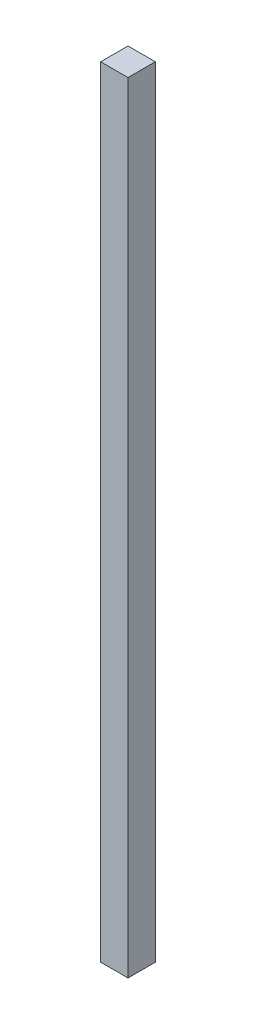
ISO-10303-21;
HEADER;
FILE_DESCRIPTION(('STEP AP214'),'2;1');
FILE_NAME('part.step','',(''),(''),'','','');
FILE_SCHEMA(('AUTOMOTIVE_DESIGN { 1 0 10303 214 1 1 1 1 }'));
ENDSEC;
DATA;
#1=APPLICATION_CONTEXT('core data for automotive mechanical design processes');
#2=APPLICATION_PROTOCOL_DEFINITION('international standard','automotive_design',2000,#1);
#3=PRODUCT_CONTEXT('',#1,'mechanical');
#4=PRODUCT('Part','Part','',(#3));
#5=PRODUCT_RELATED_PRODUCT_CATEGORY('part','',(#4));
#6=PRODUCT_DEFINITION_FORMATION('','',#4);
#7=PRODUCT_DEFINITION_CONTEXT('part definition',#1,'design');
#8=PRODUCT_DEFINITION('design','',#6,#7);
#9=PRODUCT_DEFINITION_SHAPE('','',#8);
#10=(LENGTH_UNIT() NAMED_UNIT(*) SI_UNIT(.MILLI.,.METRE.));
#11=(NAMED_UNIT(*) PLANE_ANGLE_UNIT() SI_UNIT($,.RADIAN.));
#12=(NAMED_UNIT(*) SI_UNIT($,.STERADIAN.) SOLID_ANGLE_UNIT());
#13=UNCERTAINTY_MEASURE_WITH_UNIT(LENGTH_MEASURE(1.E-05),#10,'distance_accuracy_value','');
#14=(GEOMETRIC_REPRESENTATION_CONTEXT(3) GLOBAL_UNCERTAINTY_ASSIGNED_CONTEXT((#13)) GLOBAL_UNIT_ASSIGNED_CONTEXT((#10,
#11,#12)) REPRESENTATION_CONTEXT('',''));
#15=CARTESIAN_POINT('',(0.,0.,0.));
#16=DIRECTION('',(0.,0.,1.));
#17=DIRECTION('',(1.,0.,0.));
#18=AXIS2_PLACEMENT_3D('',#15,#16,#17);
#19=CARTESIAN_POINT('',(-24.5945945945946,2000.,-16.2162162162162));
#20=DIRECTION('',(1.,0.,0.));
#21=DIRECTION('',(0.,0.,-1.));
#22=AXIS2_PLACEMENT_3D('',#19,#20,#21);
#23=PLANE('',#22);
#24=DIRECTION('',(0.,0.,1.));
#25=VECTOR('',#24,1.);
#26=CARTESIAN_POINT('',(-24.5945945945946,0.,-16.2162162162162));
#27=LINE('',#26,#25);
#28=CARTESIAN_POINT('',(-24.5945945945946,0.,-16.2162162162162));
#29=VERTEX_POINT('',#28);
#30=CARTESIAN_POINT('',(-24.5945945945946,0.,53.7837837837838));
#31=VERTEX_POINT('',#30);
#32=EDGE_CURVE('E102',#29,#31,#27,.T.);
#33=ORIENTED_EDGE('',*,*,#32,.T.);
#34=DIRECTION('',(0.,-1.,0.));
#35=VECTOR('',#34,1.);
#36=CARTESIAN_POINT('',(-24.5945945945946,2000.,53.7837837837838));
#37=LINE('',#36,#35);
#38=CARTESIAN_POINT('',(-24.5945945945946,2000.,53.7837837837838));
#39=VERTEX_POINT('',#38);
#40=EDGE_CURVE('E11',#39,#31,#37,.T.);
#41=ORIENTED_EDGE('',*,*,#40,.F.);
#42=DIRECTION('',(0.,0.,1.));
#43=VECTOR('',#42,1.);
#44=CARTESIAN_POINT('',(-24.5945945945946,2000.,-16.2162162162162));
#45=LINE('',#44,#43);
#46=CARTESIAN_POINT('',(-24.5945945945946,2000.,-16.2162162162162));
#47=VERTEX_POINT('',#46);
#48=EDGE_CURVE('E90',#47,#39,#45,.T.);
#49=ORIENTED_EDGE('',*,*,#48,.F.);
#50=DIRECTION('',(0.,-1.,0.));
#51=VECTOR('',#50,1.);
#52=CARTESIAN_POINT('',(-24.5945945945946,2000.,-16.2162162162162));
#53=LINE('',#52,#51);
#54=EDGE_CURVE('E98',#47,#29,#53,.T.);
#55=ORIENTED_EDGE('',*,*,#54,.T.);
#56=EDGE_LOOP('',(#33,#41,#49,#55));
#57=FACE_BOUND('',#56,.T.);
#58=ADVANCED_FACE('F39',(#57),#23,.F.);
#59=CARTESIAN_POINT('',(-24.5945945945946,2000.,53.7837837837838));
#60=DIRECTION('',(0.,0.,-1.));
#61=DIRECTION('',(-1.,0.,0.));
#62=AXIS2_PLACEMENT_3D('',#59,#60,#61);
#63=PLANE('',#62);
#64=DIRECTION('',(1.,0.,0.));
#65=VECTOR('',#64,1.);
#66=CARTESIAN_POINT('',(-24.5945945945946,0.,53.7837837837838));
#67=LINE('',#66,#65);
#68=CARTESIAN_POINT('',(45.4054054054054,0.,53.7837837837838));
#69=VERTEX_POINT('',#68);
#70=EDGE_CURVE('E94',#31,#69,#67,.T.);
#71=ORIENTED_EDGE('',*,*,#70,.T.);
#72=DIRECTION('',(0.,-1.,0.));
#73=VECTOR('',#72,1.);
#74=CARTESIAN_POINT('',(45.4054054054054,2000.,53.7837837837838));
#75=LINE('',#74,#73);
#76=CARTESIAN_POINT('',(45.4054054054054,2000.,53.7837837837838));
#77=VERTEX_POINT('',#76);
#78=EDGE_CURVE('E47',#77,#69,#75,.T.);
#79=ORIENTED_EDGE('',*,*,#78,.F.);
#80=DIRECTION('',(1.,0.,0.));
#81=VECTOR('',#80,1.);
#82=CARTESIAN_POINT('',(-24.5945945945946,2000.,53.7837837837838));
#83=LINE('',#82,#81);
#84=EDGE_CURVE('E85',#39,#77,#83,.T.);
#85=ORIENTED_EDGE('',*,*,#84,.F.);
#86=ORIENTED_EDGE('',*,*,#40,.T.);
#87=EDGE_LOOP('',(#71,#79,#85,#86));
#88=FACE_BOUND('',#87,.T.);
#89=ADVANCED_FACE('F93',(#88),#63,.F.);
#90=CARTESIAN_POINT('',(45.4054054054054,2000.,-16.2162162162162));
#91=DIRECTION('',(-1.,0.,0.));
#92=DIRECTION('',(0.,0.,1.));
#93=AXIS2_PLACEMENT_3D('',#90,#91,#92);
#94=PLANE('',#93);
#95=DIRECTION('',(0.,0.,-1.));
#96=VECTOR('',#95,1.);
#97=CARTESIAN_POINT('',(45.4054054054054,0.,-16.2162162162162));
#98=LINE('',#97,#96);
#99=CARTESIAN_POINT('',(45.4054054054054,0.,-16.2162162162162));
#100=VERTEX_POINT('',#99);
#101=EDGE_CURVE('E72',#69,#100,#98,.T.);
#102=ORIENTED_EDGE('',*,*,#101,.T.);
#103=DIRECTION('',(0.,-1.,0.));
#104=VECTOR('',#103,1.);
#105=CARTESIAN_POINT('',(45.4054054054054,2000.,-16.2162162162162));
#106=LINE('',#105,#104);
#107=CARTESIAN_POINT('',(45.4054054054054,2000.,-16.2162162162162));
#108=VERTEX_POINT('',#107);
#109=EDGE_CURVE('E95',#108,#100,#106,.T.);
#110=ORIENTED_EDGE('',*,*,#109,.F.);
#111=DIRECTION('',(0.,0.,-1.));
#112=VECTOR('',#111,1.);
#113=CARTESIAN_POINT('',(45.4054054054054,2000.,-16.2162162162162));
#114=LINE('',#113,#112);
#115=EDGE_CURVE('E88',#77,#108,#114,.T.);
#116=ORIENTED_EDGE('',*,*,#115,.F.);
#117=ORIENTED_EDGE('',*,*,#78,.T.);
#118=EDGE_LOOP('',(#102,#110,#116,#117));
#119=FACE_BOUND('',#118,.T.);
#120=ADVANCED_FACE('F96',(#119),#94,.F.);
#121=CARTESIAN_POINT('',(-24.5945945945946,2000.,-16.2162162162162));
#122=DIRECTION('',(0.,0.,1.));
#123=DIRECTION('',(1.,0.,0.));
#124=AXIS2_PLACEMENT_3D('',#121,#122,#123);
#125=PLANE('',#124);
#126=DIRECTION('',(-1.,0.,0.));
#127=VECTOR('',#126,1.);
#128=CARTESIAN_POINT('',(-24.5945945945946,0.,-16.2162162162162));
#129=LINE('',#128,#127);
#130=EDGE_CURVE('E78',#100,#29,#129,.T.);
#131=ORIENTED_EDGE('',*,*,#130,.T.);
#132=ORIENTED_EDGE('',*,*,#54,.F.);
#133=DIRECTION('',(-1.,0.,0.));
#134=VECTOR('',#133,1.);
#135=CARTESIAN_POINT('',(-24.5945945945946,2000.,-16.2162162162162));
#136=LINE('',#135,#134);
#137=EDGE_CURVE('E55',#108,#47,#136,.T.);
#138=ORIENTED_EDGE('',*,*,#137,.F.);
#139=ORIENTED_EDGE('',*,*,#109,.T.);
#140=EDGE_LOOP('',(#131,#132,#138,#139));
#141=FACE_BOUND('',#140,.T.);
#142=ADVANCED_FACE('F109',(#141),#125,.F.);
#143=CARTESIAN_POINT('',(0.,2000.,0.));
#144=DIRECTION('',(0.,1.,0.));
#145=DIRECTION('',(0.,0.,1.));
#146=AXIS2_PLACEMENT_3D('',#143,#144,#145);
#147=PLANE('',#146);
#148=ORIENTED_EDGE('',*,*,#48,.T.);
#149=ORIENTED_EDGE('',*,*,#84,.T.);
#150=ORIENTED_EDGE('',*,*,#115,.T.);
#151=ORIENTED_EDGE('',*,*,#137,.T.);
#152=EDGE_LOOP('',(#148,#149,#150,#151));
#153=FACE_BOUND('',#152,.T.);
#154=ADVANCED_FACE('F86',(#153),#147,.T.);
#155=CARTESIAN_POINT('',(0.,0.,0.));
#156=DIRECTION('',(0.,1.,0.));
#157=DIRECTION('',(0.,0.,1.));
#158=AXIS2_PLACEMENT_3D('',#155,#156,#157);
#159=PLANE('',#158);
#160=ORIENTED_EDGE('',*,*,#32,.F.);
#161=ORIENTED_EDGE('',*,*,#130,.F.);
#162=ORIENTED_EDGE('',*,*,#101,.F.);
#163=ORIENTED_EDGE('',*,*,#70,.F.);
#164=EDGE_LOOP('',(#160,#161,#162,#163));
#165=FACE_BOUND('',#164,.T.);
#166=ADVANCED_FACE('F112',(#165),#159,.F.);
#167=CLOSED_SHELL('',(#58,#89,#120,#142,#154,#166));
#168=MANIFOLD_SOLID_BREP('B2',#167);
#169=ADVANCED_BREP_SHAPE_REPRESENTATION('',(#18,#168),#14);
#170=SHAPE_DEFINITION_REPRESENTATION(#9,#169);
ENDSEC;
END-ISO-10303-21;
